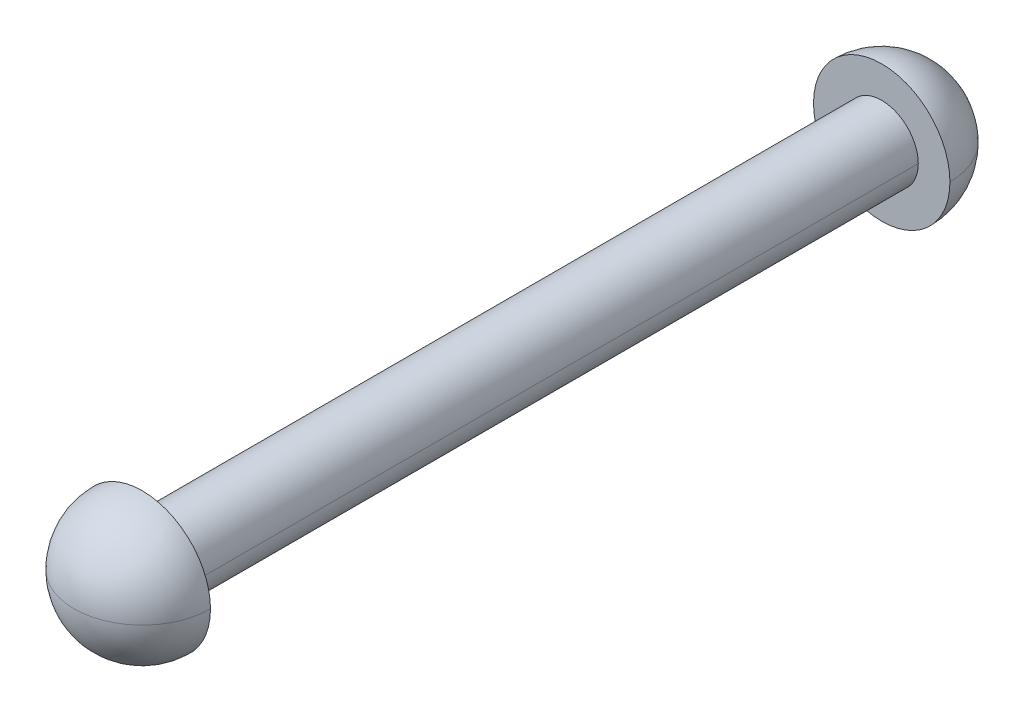
ISO-10303-21;
HEADER;
FILE_DESCRIPTION(('STEP AP214'),'2;1');
FILE_NAME('part.step','',(''),(''),'','','');
FILE_SCHEMA(('AUTOMOTIVE_DESIGN { 1 0 10303 214 1 1 1 1 }'));
ENDSEC;
DATA;
#1=APPLICATION_CONTEXT('core data for automotive mechanical design processes');
#2=APPLICATION_PROTOCOL_DEFINITION('international standard','automotive_design',2000,#1);
#3=PRODUCT_CONTEXT('',#1,'mechanical');
#4=PRODUCT('Part','Part','',(#3));
#5=PRODUCT_RELATED_PRODUCT_CATEGORY('part','',(#4));
#6=PRODUCT_DEFINITION_FORMATION('','',#4);
#7=PRODUCT_DEFINITION_CONTEXT('part definition',#1,'design');
#8=PRODUCT_DEFINITION('design','',#6,#7);
#9=PRODUCT_DEFINITION_SHAPE('','',#8);
#10=(LENGTH_UNIT() NAMED_UNIT(*) SI_UNIT(.MILLI.,.METRE.));
#11=(NAMED_UNIT(*) PLANE_ANGLE_UNIT() SI_UNIT($,.RADIAN.));
#12=(NAMED_UNIT(*) SI_UNIT($,.STERADIAN.) SOLID_ANGLE_UNIT());
#13=UNCERTAINTY_MEASURE_WITH_UNIT(LENGTH_MEASURE(1.E-05),#10,'distance_accuracy_value','');
#14=(GEOMETRIC_REPRESENTATION_CONTEXT(3) GLOBAL_UNCERTAINTY_ASSIGNED_CONTEXT((#13)) GLOBAL_UNIT_ASSIGNED_CONTEXT((#10,
#11,#12)) REPRESENTATION_CONTEXT('',''));
#15=CARTESIAN_POINT('',(0.,0.,0.));
#16=DIRECTION('',(0.,0.,1.));
#17=DIRECTION('',(1.,0.,0.));
#18=AXIS2_PLACEMENT_3D('',#15,#16,#17);
#19=CARTESIAN_POINT('',(11.,-4.24,-33.4355));
#20=DIRECTION('',(0.,0.,1.));
#21=DIRECTION('',(1.,0.,0.));
#22=AXIS2_PLACEMENT_3D('',#19,#20,#21);
#23=SPHERICAL_SURFACE('',#22,1.782);
#24=CARTESIAN_POINT('',(11.,-4.24,-33.4355));
#25=DIRECTION('',(0.,-1.,0.));
#26=DIRECTION('',(0.,0.,1.));
#27=AXIS2_PLACEMENT_3D('',#24,#25,#26);
#28=CIRCLE('',#27,1.782);
#29=CARTESIAN_POINT('',(9.218,-4.24,-33.4355));
#30=VERTEX_POINT('',#29);
#31=CARTESIAN_POINT('',(11.,-4.24,-35.2175));
#32=VERTEX_POINT('',#31);
#33=EDGE_CURVE('E83',#30,#32,#28,.T.);
#34=ORIENTED_EDGE('',*,*,#33,.T.);
#35=CARTESIAN_POINT('',(11.,-4.24,-33.4355));
#36=DIRECTION('',(0.,-1.,0.));
#37=DIRECTION('',(0.,0.,1.));
#38=AXIS2_PLACEMENT_3D('',#35,#36,#37);
#39=CIRCLE('',#38,1.782);
#40=CARTESIAN_POINT('',(12.782,-4.24,-33.4355));
#41=VERTEX_POINT('',#40);
#42=EDGE_CURVE('E84',#32,#41,#39,.T.);
#43=ORIENTED_EDGE('',*,*,#42,.T.);
#44=CARTESIAN_POINT('',(11.,-4.24,-33.4355));
#45=DIRECTION('',(0.,0.,1.));
#46=DIRECTION('',(1.,0.,0.));
#47=AXIS2_PLACEMENT_3D('',#44,#45,#46);
#48=CIRCLE('',#47,1.782);
#49=EDGE_CURVE('E11',#30,#41,#48,.T.);
#50=ORIENTED_EDGE('',*,*,#49,.F.);
#51=EDGE_LOOP('',(#34,#43,#50));
#52=FACE_BOUND('',#51,.T.);
#53=ADVANCED_FACE('F17',(#52),#23,.T.);
#54=CARTESIAN_POINT('',(11.,-4.24,-33.4355));
#55=DIRECTION('',(0.,0.,-1.));
#56=DIRECTION('',(0.,-1.,0.));
#57=AXIS2_PLACEMENT_3D('',#54,#55,#56);
#58=PLANE('',#57);
#59=CARTESIAN_POINT('',(11.,-4.24,-33.4355));
#60=DIRECTION('',(0.,0.,-1.));
#61=DIRECTION('',(1.,0.,0.));
#62=AXIS2_PLACEMENT_3D('',#59,#60,#61);
#63=CIRCLE('',#62,0.955);
#64=CARTESIAN_POINT('',(11.955,-4.24,-33.4355));
#65=VERTEX_POINT('',#64);
#66=CARTESIAN_POINT('',(10.045,-4.24,-33.4355));
#67=VERTEX_POINT('',#66);
#68=EDGE_CURVE('E47',#65,#67,#63,.T.);
#69=ORIENTED_EDGE('',*,*,#68,.T.);
#70=CARTESIAN_POINT('',(11.,-4.24,-33.4355));
#71=DIRECTION('',(0.,0.,-1.));
#72=DIRECTION('',(1.,0.,0.));
#73=AXIS2_PLACEMENT_3D('',#70,#71,#72);
#74=CIRCLE('',#73,0.955);
#75=EDGE_CURVE('E119',#67,#65,#74,.T.);
#76=ORIENTED_EDGE('',*,*,#75,.T.);
#77=EDGE_LOOP('',(#69,#76));
#78=FACE_BOUND('',#77,.T.);
#79=CARTESIAN_POINT('',(11.,-4.24,-33.4355));
#80=DIRECTION('',(0.,0.,1.));
#81=DIRECTION('',(1.,0.,0.));
#82=AXIS2_PLACEMENT_3D('',#79,#80,#81);
#83=CIRCLE('',#82,1.782);
#84=EDGE_CURVE('E87',#41,#30,#83,.T.);
#85=ORIENTED_EDGE('',*,*,#84,.T.);
#86=ORIENTED_EDGE('',*,*,#49,.T.);
#87=EDGE_LOOP('',(#85,#86));
#88=FACE_BOUND('',#87,.T.);
#89=ADVANCED_FACE('F88',(#78,#88),#58,.F.);
#90=CARTESIAN_POINT('',(11.,-4.24,-14.1145));
#91=DIRECTION('',(0.,0.,1.));
#92=DIRECTION('',(1.,0.,0.));
#93=AXIS2_PLACEMENT_3D('',#90,#91,#92);
#94=PLANE('',#93);
#95=CARTESIAN_POINT('',(11.,-4.24,-14.1145));
#96=DIRECTION('',(0.,0.,1.));
#97=DIRECTION('',(1.,0.,0.));
#98=AXIS2_PLACEMENT_3D('',#95,#96,#97);
#99=CIRCLE('',#98,0.955);
#100=CARTESIAN_POINT('',(11.955,-4.24,-14.1145));
#101=VERTEX_POINT('',#100);
#102=CARTESIAN_POINT('',(10.045,-4.24,-14.1145));
#103=VERTEX_POINT('',#102);
#104=EDGE_CURVE('E103',#101,#103,#99,.T.);
#105=ORIENTED_EDGE('',*,*,#104,.T.);
#106=CARTESIAN_POINT('',(11.,-4.24,-14.1145));
#107=DIRECTION('',(0.,0.,1.));
#108=DIRECTION('',(1.,0.,0.));
#109=AXIS2_PLACEMENT_3D('',#106,#107,#108);
#110=CIRCLE('',#109,0.955);
#111=EDGE_CURVE('E38',#103,#101,#110,.T.);
#112=ORIENTED_EDGE('',*,*,#111,.T.);
#113=EDGE_LOOP('',(#105,#112));
#114=FACE_BOUND('',#113,.T.);
#115=CARTESIAN_POINT('',(11.,-4.24,-14.1145));
#116=DIRECTION('',(0.,0.,1.));
#117=DIRECTION('',(1.,0.,0.));
#118=AXIS2_PLACEMENT_3D('',#115,#116,#117);
#119=CIRCLE('',#118,1.782);
#120=CARTESIAN_POINT('',(12.782,-4.24,-14.1145));
#121=VERTEX_POINT('',#120);
#122=CARTESIAN_POINT('',(9.218,-4.24,-14.1145));
#123=VERTEX_POINT('',#122);
#124=EDGE_CURVE('E110',#121,#123,#119,.T.);
#125=ORIENTED_EDGE('',*,*,#124,.F.);
#126=CARTESIAN_POINT('',(11.,-4.24,-14.1145));
#127=DIRECTION('',(0.,0.,1.));
#128=DIRECTION('',(1.,0.,0.));
#129=AXIS2_PLACEMENT_3D('',#126,#127,#128);
#130=CIRCLE('',#129,1.782);
#131=EDGE_CURVE('E20',#123,#121,#130,.T.);
#132=ORIENTED_EDGE('',*,*,#131,.F.);
#133=EDGE_LOOP('',(#125,#132));
#134=FACE_BOUND('',#133,.T.);
#135=ADVANCED_FACE('F134',(#114,#134),#94,.F.);
#136=CARTESIAN_POINT('',(11.,-4.24,-14.1145));
#137=DIRECTION('',(0.,0.,1.));
#138=DIRECTION('',(1.,0.,0.));
#139=AXIS2_PLACEMENT_3D('',#136,#137,#138);
#140=SPHERICAL_SURFACE('',#139,1.782);
#141=CARTESIAN_POINT('',(11.,-4.24,-14.1145));
#142=DIRECTION('',(0.,-1.,0.));
#143=DIRECTION('',(0.,0.,1.));
#144=AXIS2_PLACEMENT_3D('',#141,#142,#143);
#145=CIRCLE('',#144,1.782);
#146=CARTESIAN_POINT('',(11.,-4.24,-12.3325));
#147=VERTEX_POINT('',#146);
#148=EDGE_CURVE('E102',#121,#147,#145,.T.);
#149=ORIENTED_EDGE('',*,*,#148,.T.);
#150=CARTESIAN_POINT('',(11.,-4.24,-14.1145));
#151=DIRECTION('',(0.,-1.,0.));
#152=DIRECTION('',(0.,0.,1.));
#153=AXIS2_PLACEMENT_3D('',#150,#151,#152);
#154=CIRCLE('',#153,1.782);
#155=EDGE_CURVE('E113',#147,#123,#154,.T.);
#156=ORIENTED_EDGE('',*,*,#155,.T.);
#157=ORIENTED_EDGE('',*,*,#131,.T.);
#158=EDGE_LOOP('',(#149,#156,#157));
#159=FACE_BOUND('',#158,.T.);
#160=ADVANCED_FACE('F131',(#159),#140,.T.);
#161=CARTESIAN_POINT('',(11.,-4.24,-23.775));
#162=DIRECTION('',(0.,0.,1.));
#163=DIRECTION('',(1.,0.,0.));
#164=AXIS2_PLACEMENT_3D('',#161,#162,#163);
#165=CYLINDRICAL_SURFACE('',#164,0.955);
#166=DIRECTION('',(0.,0.,1.));
#167=VECTOR('',#166,1.);
#168=CARTESIAN_POINT('',(11.955,-4.24,-23.775));
#169=LINE('',#168,#167);
#170=EDGE_CURVE('E116',#65,#101,#169,.T.);
#171=ORIENTED_EDGE('',*,*,#170,.T.);
#172=ORIENTED_EDGE('',*,*,#111,.F.);
#173=DIRECTION('',(0.,0.,-1.));
#174=VECTOR('',#173,1.);
#175=CARTESIAN_POINT('',(10.045,-4.24,-23.775));
#176=LINE('',#175,#174);
#177=EDGE_CURVE('E106',#103,#67,#176,.T.);
#178=ORIENTED_EDGE('',*,*,#177,.T.);
#179=ORIENTED_EDGE('',*,*,#68,.F.);
#180=EDGE_LOOP('',(#171,#172,#178,#179));
#181=FACE_BOUND('',#180,.T.);
#182=ADVANCED_FACE('F145',(#181),#165,.T.);
#183=CARTESIAN_POINT('',(11.,-4.24,-23.775));
#184=DIRECTION('',(0.,0.,1.));
#185=DIRECTION('',(1.,0.,0.));
#186=AXIS2_PLACEMENT_3D('',#183,#184,#185);
#187=CYLINDRICAL_SURFACE('',#186,0.955);
#188=ORIENTED_EDGE('',*,*,#170,.F.);
#189=ORIENTED_EDGE('',*,*,#75,.F.);
#190=ORIENTED_EDGE('',*,*,#177,.F.);
#191=ORIENTED_EDGE('',*,*,#104,.F.);
#192=EDGE_LOOP('',(#188,#189,#190,#191));
#193=FACE_BOUND('',#192,.T.);
#194=ADVANCED_FACE('F138',(#193),#187,.T.);
#195=CARTESIAN_POINT('',(11.,-4.24,-14.1145));
#196=DIRECTION('',(0.,0.,1.));
#197=DIRECTION('',(1.,0.,0.));
#198=AXIS2_PLACEMENT_3D('',#195,#196,#197);
#199=SPHERICAL_SURFACE('',#198,1.782);
#200=ORIENTED_EDGE('',*,*,#148,.F.);
#201=ORIENTED_EDGE('',*,*,#124,.T.);
#202=ORIENTED_EDGE('',*,*,#155,.F.);
#203=EDGE_LOOP('',(#200,#201,#202));
#204=FACE_BOUND('',#203,.T.);
#205=ADVANCED_FACE('F136',(#204),#199,.T.);
#206=CARTESIAN_POINT('',(11.,-4.24,-33.4355));
#207=DIRECTION('',(0.,0.,1.));
#208=DIRECTION('',(1.,0.,0.));
#209=AXIS2_PLACEMENT_3D('',#206,#207,#208);
#210=SPHERICAL_SURFACE('',#209,1.782);
#211=ORIENTED_EDGE('',*,*,#33,.F.);
#212=ORIENTED_EDGE('',*,*,#84,.F.);
#213=ORIENTED_EDGE('',*,*,#42,.F.);
#214=EDGE_LOOP('',(#211,#212,#213));
#215=FACE_BOUND('',#214,.T.);
#216=ADVANCED_FACE('F92',(#215),#210,.T.);
#217=CLOSED_SHELL('',(#53,#89,#135,#160,#182,#194,#205,#216));
#218=MANIFOLD_SOLID_BREP('B1',#217);
#219=ADVANCED_BREP_SHAPE_REPRESENTATION('',(#18,#218),#14);
#220=SHAPE_DEFINITION_REPRESENTATION(#9,#219);
ENDSEC;
END-ISO-10303-21;
